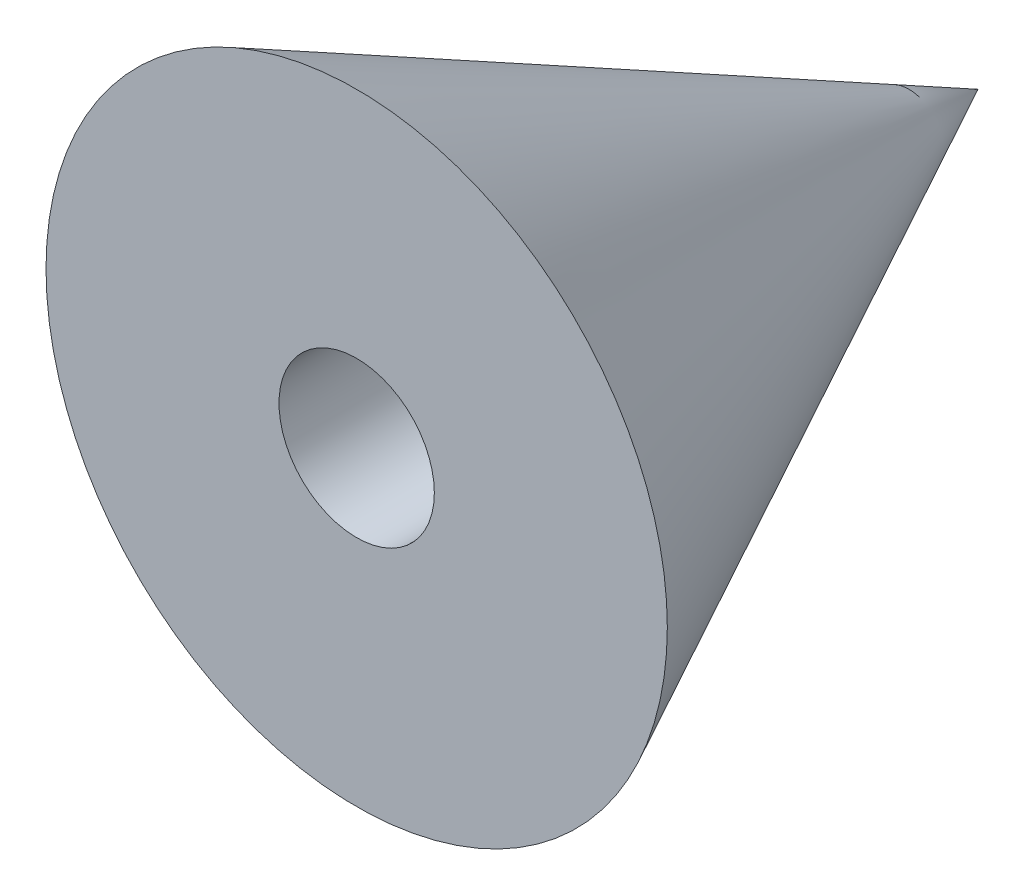
ISO-10303-21;
HEADER;
FILE_DESCRIPTION(('STEP AP214'),'2;1');
FILE_NAME('part.step','',(''),(''),'','','');
FILE_SCHEMA(('AUTOMOTIVE_DESIGN { 1 0 10303 214 1 1 1 1 }'));
ENDSEC;
DATA;
#1=APPLICATION_CONTEXT('core data for automotive mechanical design processes');
#2=APPLICATION_PROTOCOL_DEFINITION('international standard','automotive_design',2000,#1);
#3=PRODUCT_CONTEXT('',#1,'mechanical');
#4=PRODUCT('Part','Part','',(#3));
#5=PRODUCT_RELATED_PRODUCT_CATEGORY('part','',(#4));
#6=PRODUCT_DEFINITION_FORMATION('','',#4);
#7=PRODUCT_DEFINITION_CONTEXT('part definition',#1,'design');
#8=PRODUCT_DEFINITION('design','',#6,#7);
#9=PRODUCT_DEFINITION_SHAPE('','',#8);
#10=(LENGTH_UNIT() NAMED_UNIT(*) SI_UNIT(.MILLI.,.METRE.));
#11=(NAMED_UNIT(*) PLANE_ANGLE_UNIT() SI_UNIT($,.RADIAN.));
#12=(NAMED_UNIT(*) SI_UNIT($,.STERADIAN.) SOLID_ANGLE_UNIT());
#13=UNCERTAINTY_MEASURE_WITH_UNIT(LENGTH_MEASURE(1.E-05),#10,'distance_accuracy_value','');
#14=(GEOMETRIC_REPRESENTATION_CONTEXT(3) GLOBAL_UNCERTAINTY_ASSIGNED_CONTEXT((#13)) GLOBAL_UNIT_ASSIGNED_CONTEXT((#10,
#11,#12)) REPRESENTATION_CONTEXT('',''));
#15=CARTESIAN_POINT('',(0.,0.,0.));
#16=DIRECTION('',(0.,0.,1.));
#17=DIRECTION('',(1.,0.,0.));
#18=AXIS2_PLACEMENT_3D('',#15,#16,#17);
#19=CARTESIAN_POINT('',(0.,0.,0.));
#20=DIRECTION('',(0.,0.,1.));
#21=DIRECTION('',(1.,0.,0.));
#22=AXIS2_PLACEMENT_3D('',#19,#20,#21);
#23=PLANE('',#22);
#24=CARTESIAN_POINT('',(0.,0.,0.));
#25=DIRECTION('',(0.,0.,1.));
#26=DIRECTION('',(1.,0.,0.));
#27=AXIS2_PLACEMENT_3D('',#24,#25,#26);
#28=CIRCLE('',#27,2.5);
#29=CARTESIAN_POINT('',(2.5,0.,0.));
#30=VERTEX_POINT('',#29);
#31=EDGE_CURVE('E64',#30,#30,#28,.T.);
#32=ORIENTED_EDGE('',*,*,#31,.F.);
#33=EDGE_LOOP('',(#32));
#34=FACE_BOUND('',#33,.T.);
#35=CARTESIAN_POINT('',(0.,0.,0.));
#36=DIRECTION('',(0.,0.,-1.));
#37=DIRECTION('',(-1.,0.,0.));
#38=AXIS2_PLACEMENT_3D('',#35,#36,#37);
#39=CIRCLE('',#38,10.);
#40=CARTESIAN_POINT('',(-10.,0.,0.));
#41=VERTEX_POINT('',#40);
#42=EDGE_CURVE('E11',#41,#41,#39,.T.);
#43=ORIENTED_EDGE('',*,*,#42,.F.);
#44=EDGE_LOOP('',(#43));
#45=FACE_BOUND('',#44,.T.);
#46=ADVANCED_FACE('F36',(#34,#45),#23,.T.);
#47=CARTESIAN_POINT('',(0.,0.,-20.));
#48=DIRECTION('',(0.,0.,1.));
#49=DIRECTION('',(1.,0.,0.));
#50=AXIS2_PLACEMENT_3D('',#47,#48,#49);
#51=CONICAL_SURFACE('',#50,0.,0.463647609000806);
#52=ORIENTED_EDGE('',*,*,#42,.T.);
#53=EDGE_LOOP('',(#52));
#54=FACE_BOUND('',#53,.T.);
#55=CARTESIAN_POINT('',(0.,0.,-20.));
#56=VERTEX_POINT('',#55);
#57=VERTEX_LOOP('',#56);
#58=FACE_BOUND('',#57,.T.);
#59=ADVANCED_FACE('F45',(#54,#58),#51,.T.);
#60=CARTESIAN_POINT('',(0.,0.,-5.));
#61=DIRECTION('',(0.,0.,1.));
#62=DIRECTION('',(1.,0.,0.));
#63=AXIS2_PLACEMENT_3D('',#60,#61,#62);
#64=CYLINDRICAL_SURFACE('',#63,2.5);
#65=CARTESIAN_POINT('',(0.,0.,-5.));
#66=DIRECTION('',(0.,0.,1.));
#67=DIRECTION('',(1.,0.,0.));
#68=AXIS2_PLACEMENT_3D('',#65,#66,#67);
#69=CIRCLE('',#68,2.5);
#70=CARTESIAN_POINT('',(2.5,0.,-5.));
#71=VERTEX_POINT('',#70);
#72=EDGE_CURVE('E42',#71,#71,#69,.T.);
#73=ORIENTED_EDGE('',*,*,#72,.F.);
#74=EDGE_LOOP('',(#73));
#75=FACE_BOUND('',#74,.T.);
#76=ORIENTED_EDGE('',*,*,#31,.T.);
#77=EDGE_LOOP('',(#76));
#78=FACE_BOUND('',#77,.T.);
#79=ADVANCED_FACE('F47',(#75,#78),#64,.F.);
#80=CARTESIAN_POINT('',(0.,0.,-5.));
#81=DIRECTION('',(0.,0.,1.));
#82=DIRECTION('',(1.,0.,0.));
#83=AXIS2_PLACEMENT_3D('',#80,#81,#82);
#84=PLANE('',#83);
#85=ORIENTED_EDGE('',*,*,#72,.T.);
#86=EDGE_LOOP('',(#85));
#87=FACE_BOUND('',#86,.T.);
#88=ADVANCED_FACE('F53',(#87),#84,.T.);
#89=CLOSED_SHELL('',(#46,#59,#79,#88));
#90=MANIFOLD_SOLID_BREP('B2',#89);
#91=ADVANCED_BREP_SHAPE_REPRESENTATION('',(#18,#90),#14);
#92=SHAPE_DEFINITION_REPRESENTATION(#9,#91);
ENDSEC;
END-ISO-10303-21;
